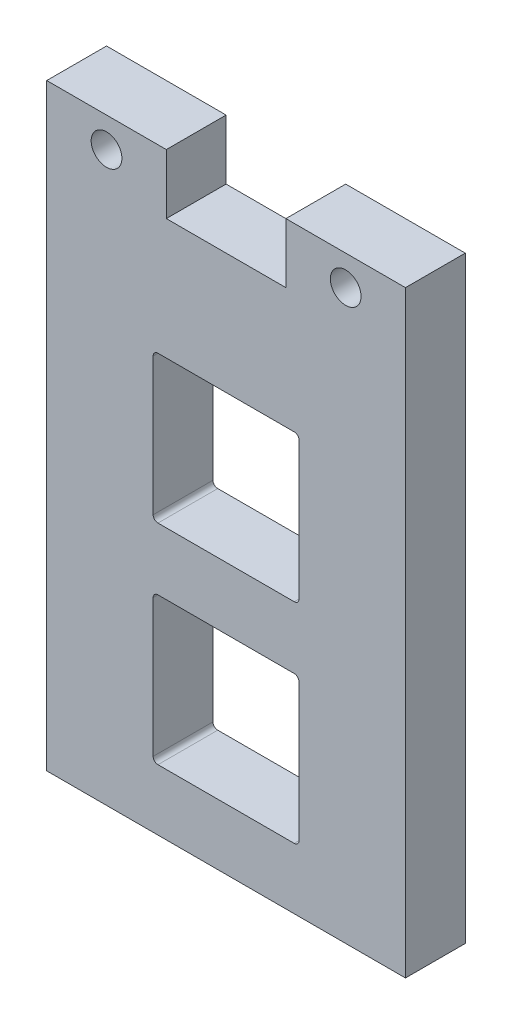
ISO-10303-21;
HEADER;
FILE_DESCRIPTION(('STEP AP214'),'2;1');
FILE_NAME('part.step','',(''),(''),'','','');
FILE_SCHEMA(('AUTOMOTIVE_DESIGN { 1 0 10303 214 1 1 1 1 }'));
ENDSEC;
DATA;
#1=APPLICATION_CONTEXT('core data for automotive mechanical design processes');
#2=APPLICATION_PROTOCOL_DEFINITION('international standard','automotive_design',2000,#1);
#3=PRODUCT_CONTEXT('',#1,'mechanical');
#4=PRODUCT('Part','Part','',(#3));
#5=PRODUCT_RELATED_PRODUCT_CATEGORY('part','',(#4));
#6=PRODUCT_DEFINITION_FORMATION('','',#4);
#7=PRODUCT_DEFINITION_CONTEXT('part definition',#1,'design');
#8=PRODUCT_DEFINITION('design','',#6,#7);
#9=PRODUCT_DEFINITION_SHAPE('','',#8);
#10=(LENGTH_UNIT() NAMED_UNIT(*) SI_UNIT(.MILLI.,.METRE.));
#11=(NAMED_UNIT(*) PLANE_ANGLE_UNIT() SI_UNIT($,.RADIAN.));
#12=(NAMED_UNIT(*) SI_UNIT($,.STERADIAN.) SOLID_ANGLE_UNIT());
#13=UNCERTAINTY_MEASURE_WITH_UNIT(LENGTH_MEASURE(1.E-05),#10,'distance_accuracy_value','');
#14=(GEOMETRIC_REPRESENTATION_CONTEXT(3) GLOBAL_UNCERTAINTY_ASSIGNED_CONTEXT((#13)) GLOBAL_UNIT_ASSIGNED_CONTEXT((#10,
#11,#12)) REPRESENTATION_CONTEXT('',''));
#15=CARTESIAN_POINT('',(0.,0.,0.));
#16=DIRECTION('',(0.,0.,1.));
#17=DIRECTION('',(1.,0.,0.));
#18=AXIS2_PLACEMENT_3D('',#15,#16,#17);
#19=CARTESIAN_POINT('',(0.,0.,3.175));
#20=DIRECTION('',(0.,-1.,0.));
#21=DIRECTION('',(0.,0.,-1.));
#22=AXIS2_PLACEMENT_3D('',#19,#20,#21);
#23=PLANE('',#22);
#24=DIRECTION('',(-1.,0.,0.));
#25=VECTOR('',#24,1.);
#26=CARTESIAN_POINT('',(0.,0.,-3.175));
#27=LINE('',#26,#25);
#28=CARTESIAN_POINT('',(38.1,0.,-3.175));
#29=VERTEX_POINT('',#28);
#30=CARTESIAN_POINT('',(25.4,0.,-3.175));
#31=VERTEX_POINT('',#30);
#32=EDGE_CURVE('E259',#29,#31,#27,.T.);
#33=ORIENTED_EDGE('',*,*,#32,.T.);
#34=DIRECTION('',(0.,0.,1.));
#35=VECTOR('',#34,1.);
#36=CARTESIAN_POINT('',(25.4,0.,-3.176));
#37=LINE('',#36,#35);
#38=CARTESIAN_POINT('',(25.4,0.,3.175));
#39=VERTEX_POINT('',#38);
#40=EDGE_CURVE('E241',#31,#39,#37,.T.);
#41=ORIENTED_EDGE('',*,*,#40,.T.);
#42=DIRECTION('',(-1.,0.,0.));
#43=VECTOR('',#42,1.);
#44=CARTESIAN_POINT('',(0.,0.,3.175));
#45=LINE('',#44,#43);
#46=CARTESIAN_POINT('',(38.1,0.,3.175));
#47=VERTEX_POINT('',#46);
#48=EDGE_CURVE('E283',#47,#39,#45,.T.);
#49=ORIENTED_EDGE('',*,*,#48,.F.);
#50=DIRECTION('',(0.,0.,-1.));
#51=VECTOR('',#50,1.);
#52=CARTESIAN_POINT('',(38.1,0.,3.175));
#53=LINE('',#52,#51);
#54=EDGE_CURVE('E266',#47,#29,#53,.T.);
#55=ORIENTED_EDGE('',*,*,#54,.T.);
#56=EDGE_LOOP('',(#33,#41,#49,#55));
#57=FACE_BOUND('',#56,.T.);
#58=ADVANCED_FACE('F40',(#57),#23,.F.);
#59=CARTESIAN_POINT('',(0.,0.,3.175));
#60=DIRECTION('',(1.,0.,0.));
#61=DIRECTION('',(0.,1.,0.));
#62=AXIS2_PLACEMENT_3D('',#59,#60,#61);
#63=PLANE('',#62);
#64=DIRECTION('',(0.,-1.,0.));
#65=VECTOR('',#64,1.);
#66=CARTESIAN_POINT('',(0.,0.,-3.175));
#67=LINE('',#66,#65);
#68=CARTESIAN_POINT('',(0.,0.,-3.175));
#69=VERTEX_POINT('',#68);
#70=CARTESIAN_POINT('',(0.,-63.5,-3.175));
#71=VERTEX_POINT('',#70);
#72=EDGE_CURVE('E477',#69,#71,#67,.T.);
#73=ORIENTED_EDGE('',*,*,#72,.T.);
#74=DIRECTION('',(0.,0.,-1.));
#75=VECTOR('',#74,1.);
#76=CARTESIAN_POINT('',(0.,-63.5,3.175));
#77=LINE('',#76,#75);
#78=CARTESIAN_POINT('',(0.,-63.5,3.175));
#79=VERTEX_POINT('',#78);
#80=EDGE_CURVE('E289',#79,#71,#77,.T.);
#81=ORIENTED_EDGE('',*,*,#80,.F.);
#82=DIRECTION('',(0.,-1.,0.));
#83=VECTOR('',#82,1.);
#84=CARTESIAN_POINT('',(0.,0.,3.175));
#85=LINE('',#84,#83);
#86=CARTESIAN_POINT('',(0.,0.,3.175));
#87=VERTEX_POINT('',#86);
#88=EDGE_CURVE('E267',#87,#79,#85,.T.);
#89=ORIENTED_EDGE('',*,*,#88,.F.);
#90=DIRECTION('',(0.,0.,-1.));
#91=VECTOR('',#90,1.);
#92=CARTESIAN_POINT('',(0.,0.,3.175));
#93=LINE('',#92,#91);
#94=EDGE_CURVE('E279',#87,#69,#93,.T.);
#95=ORIENTED_EDGE('',*,*,#94,.T.);
#96=EDGE_LOOP('',(#73,#81,#89,#95));
#97=FACE_BOUND('',#96,.T.);
#98=ADVANCED_FACE('F500',(#97),#63,.F.);
#99=CARTESIAN_POINT('',(0.,-63.5,3.175));
#100=DIRECTION('',(0.,1.,0.));
#101=DIRECTION('',(0.,0.,1.));
#102=AXIS2_PLACEMENT_3D('',#99,#100,#101);
#103=PLANE('',#102);
#104=DIRECTION('',(1.,0.,0.));
#105=VECTOR('',#104,1.);
#106=CARTESIAN_POINT('',(0.,-63.5,-3.175));
#107=LINE('',#106,#105);
#108=CARTESIAN_POINT('',(38.1,-63.5,-3.175));
#109=VERTEX_POINT('',#108);
#110=EDGE_CURVE('E488',#71,#109,#107,.T.);
#111=ORIENTED_EDGE('',*,*,#110,.T.);
#112=DIRECTION('',(0.,0.,-1.));
#113=VECTOR('',#112,1.);
#114=CARTESIAN_POINT('',(38.1,-63.5,3.175));
#115=LINE('',#114,#113);
#116=CARTESIAN_POINT('',(38.1,-63.5,3.175));
#117=VERTEX_POINT('',#116);
#118=EDGE_CURVE('E285',#117,#109,#115,.T.);
#119=ORIENTED_EDGE('',*,*,#118,.F.);
#120=DIRECTION('',(1.,0.,0.));
#121=VECTOR('',#120,1.);
#122=CARTESIAN_POINT('',(0.,-63.5,3.175));
#123=LINE('',#122,#121);
#124=EDGE_CURVE('E272',#79,#117,#123,.T.);
#125=ORIENTED_EDGE('',*,*,#124,.F.);
#126=ORIENTED_EDGE('',*,*,#80,.T.);
#127=EDGE_LOOP('',(#111,#119,#125,#126));
#128=FACE_BOUND('',#127,.T.);
#129=ADVANCED_FACE('F497',(#128),#103,.F.);
#130=CARTESIAN_POINT('',(38.1,-63.5,3.175));
#131=DIRECTION('',(-1.,0.,0.));
#132=DIRECTION('',(0.,0.,1.));
#133=AXIS2_PLACEMENT_3D('',#130,#131,#132);
#134=PLANE('',#133);
#135=DIRECTION('',(0.,1.,0.));
#136=VECTOR('',#135,1.);
#137=CARTESIAN_POINT('',(38.1,-63.5,-3.175));
#138=LINE('',#137,#136);
#139=EDGE_CURVE('E275',#109,#29,#138,.T.);
#140=ORIENTED_EDGE('',*,*,#139,.T.);
#141=ORIENTED_EDGE('',*,*,#54,.F.);
#142=DIRECTION('',(0.,1.,0.));
#143=VECTOR('',#142,1.);
#144=CARTESIAN_POINT('',(38.1,-63.5,3.175));
#145=LINE('',#144,#143);
#146=EDGE_CURVE('E481',#117,#47,#145,.T.);
#147=ORIENTED_EDGE('',*,*,#146,.F.);
#148=ORIENTED_EDGE('',*,*,#118,.T.);
#149=EDGE_LOOP('',(#140,#141,#147,#148));
#150=FACE_BOUND('',#149,.T.);
#151=ADVANCED_FACE('F492',(#150),#134,.F.);
#152=CARTESIAN_POINT('',(12.7,0.,3.175));
#153=VERTEX_POINT('',#152);
#154=EDGE_CURVE('E484',#153,#87,#45,.T.);
#155=ORIENTED_EDGE('',*,*,#154,.F.);
#156=DIRECTION('',(0.,0.,1.));
#157=VECTOR('',#156,1.);
#158=CARTESIAN_POINT('',(12.7,0.,-3.176));
#159=LINE('',#158,#157);
#160=CARTESIAN_POINT('',(12.7,0.,-3.175));
#161=VERTEX_POINT('',#160);
#162=EDGE_CURVE('E252',#161,#153,#159,.T.);
#163=ORIENTED_EDGE('',*,*,#162,.F.);
#164=EDGE_CURVE('E268',#161,#69,#27,.T.);
#165=ORIENTED_EDGE('',*,*,#164,.T.);
#166=ORIENTED_EDGE('',*,*,#94,.F.);
#167=EDGE_LOOP('',(#155,#163,#165,#166));
#168=FACE_BOUND('',#167,.T.);
#169=ADVANCED_FACE('F504',(#168),#23,.F.);
#170=CARTESIAN_POINT('',(0.,0.,3.175));
#171=DIRECTION('',(0.,0.,1.));
#172=DIRECTION('',(1.,0.,0.));
#173=AXIS2_PLACEMENT_3D('',#170,#171,#172);
#174=PLANE('',#173);
#175=DIRECTION('',(-1.,0.,0.));
#176=VECTOR('',#175,1.);
#177=CARTESIAN_POINT('',(26.797,-57.023,3.175));
#178=LINE('',#177,#176);
#179=CARTESIAN_POINT('',(26.289,-57.023,3.175));
#180=VERTEX_POINT('',#179);
#181=CARTESIAN_POINT('',(11.811,-57.023,3.175));
#182=VERTEX_POINT('',#181);
#183=EDGE_CURVE('E518',#180,#182,#178,.T.);
#184=ORIENTED_EDGE('',*,*,#183,.T.);
#185=CARTESIAN_POINT('',(11.811,-56.515,3.175));
#186=DIRECTION('',(0.,0.,1.));
#187=DIRECTION('',(1.,0.,0.));
#188=AXIS2_PLACEMENT_3D('',#185,#186,#187);
#189=CIRCLE('',#188,0.508);
#190=CARTESIAN_POINT('',(11.303,-56.515,3.175));
#191=VERTEX_POINT('',#190);
#192=EDGE_CURVE('E362',#182,#191,#189,.F.);
#193=ORIENTED_EDGE('',*,*,#192,.T.);
#194=DIRECTION('',(0.,1.,0.));
#195=VECTOR('',#194,1.);
#196=CARTESIAN_POINT('',(11.303,-57.023,3.175));
#197=LINE('',#196,#195);
#198=CARTESIAN_POINT('',(11.303,-41.91,3.175));
#199=VERTEX_POINT('',#198);
#200=EDGE_CURVE('E531',#191,#199,#197,.T.);
#201=ORIENTED_EDGE('',*,*,#200,.T.);
#202=CARTESIAN_POINT('',(11.811,-41.91,3.175));
#203=DIRECTION('',(0.,0.,1.));
#204=DIRECTION('',(1.,0.,0.));
#205=AXIS2_PLACEMENT_3D('',#202,#203,#204);
#206=CIRCLE('',#205,0.508);
#207=CARTESIAN_POINT('',(11.811,-41.402,3.175));
#208=VERTEX_POINT('',#207);
#209=EDGE_CURVE('E356',#199,#208,#206,.F.);
#210=ORIENTED_EDGE('',*,*,#209,.T.);
#211=DIRECTION('',(1.,0.,0.));
#212=VECTOR('',#211,1.);
#213=CARTESIAN_POINT('',(26.797,-41.402,3.175));
#214=LINE('',#213,#212);
#215=CARTESIAN_POINT('',(26.289,-41.402,3.175));
#216=VERTEX_POINT('',#215);
#217=EDGE_CURVE('E416',#208,#216,#214,.T.);
#218=ORIENTED_EDGE('',*,*,#217,.T.);
#219=CARTESIAN_POINT('',(26.289,-41.91,3.175));
#220=DIRECTION('',(0.,0.,1.));
#221=DIRECTION('',(1.,0.,0.));
#222=AXIS2_PLACEMENT_3D('',#219,#220,#221);
#223=CIRCLE('',#222,0.508);
#224=CARTESIAN_POINT('',(26.797,-41.91,3.175));
#225=VERTEX_POINT('',#224);
#226=EDGE_CURVE('E350',#216,#225,#223,.F.);
#227=ORIENTED_EDGE('',*,*,#226,.T.);
#228=DIRECTION('',(0.,-1.,0.));
#229=VECTOR('',#228,1.);
#230=CARTESIAN_POINT('',(26.797,-57.023,3.175));
#231=LINE('',#230,#229);
#232=CARTESIAN_POINT('',(26.797,-56.515,3.175));
#233=VERTEX_POINT('',#232);
#234=EDGE_CURVE('E516',#225,#233,#231,.T.);
#235=ORIENTED_EDGE('',*,*,#234,.T.);
#236=CARTESIAN_POINT('',(26.289,-56.515,3.175));
#237=DIRECTION('',(0.,0.,1.));
#238=DIRECTION('',(1.,0.,0.));
#239=AXIS2_PLACEMENT_3D('',#236,#237,#238);
#240=CIRCLE('',#239,0.508);
#241=EDGE_CURVE('E368',#233,#180,#240,.F.);
#242=ORIENTED_EDGE('',*,*,#241,.T.);
#243=EDGE_LOOP('',(#184,#193,#201,#210,#218,#227,#235,#242));
#244=FACE_BOUND('',#243,.T.);
#245=DIRECTION('',(-1.,0.,0.));
#246=VECTOR('',#245,1.);
#247=CARTESIAN_POINT('',(26.797,-34.798,3.175));
#248=LINE('',#247,#246);
#249=CARTESIAN_POINT('',(26.289,-34.798,3.175));
#250=VERTEX_POINT('',#249);
#251=CARTESIAN_POINT('',(11.811,-34.798,3.175));
#252=VERTEX_POINT('',#251);
#253=EDGE_CURVE('E415',#250,#252,#248,.T.);
#254=ORIENTED_EDGE('',*,*,#253,.T.);
#255=CARTESIAN_POINT('',(11.811,-34.29,3.175));
#256=DIRECTION('',(0.,0.,1.));
#257=DIRECTION('',(1.,0.,0.));
#258=AXIS2_PLACEMENT_3D('',#255,#256,#257);
#259=CIRCLE('',#258,0.508);
#260=CARTESIAN_POINT('',(11.303,-34.29,3.175));
#261=VERTEX_POINT('',#260);
#262=EDGE_CURVE('E380',#252,#261,#259,.F.);
#263=ORIENTED_EDGE('',*,*,#262,.T.);
#264=DIRECTION('',(0.,1.,0.));
#265=VECTOR('',#264,1.);
#266=CARTESIAN_POINT('',(11.303,-34.798,3.175));
#267=LINE('',#266,#265);
#268=CARTESIAN_POINT('',(11.303,-19.685,3.175));
#269=VERTEX_POINT('',#268);
#270=EDGE_CURVE('E421',#261,#269,#267,.T.);
#271=ORIENTED_EDGE('',*,*,#270,.T.);
#272=CARTESIAN_POINT('',(11.811,-19.685,3.175));
#273=DIRECTION('',(0.,0.,1.));
#274=DIRECTION('',(1.,0.,0.));
#275=AXIS2_PLACEMENT_3D('',#272,#273,#274);
#276=CIRCLE('',#275,0.508);
#277=CARTESIAN_POINT('',(11.811,-19.177,3.175));
#278=VERTEX_POINT('',#277);
#279=EDGE_CURVE('E69',#269,#278,#276,.F.);
#280=ORIENTED_EDGE('',*,*,#279,.T.);
#281=DIRECTION('',(1.,0.,0.));
#282=VECTOR('',#281,1.);
#283=CARTESIAN_POINT('',(26.797,-19.177,3.175));
#284=LINE('',#283,#282);
#285=CARTESIAN_POINT('',(26.289,-19.177,3.175));
#286=VERTEX_POINT('',#285);
#287=EDGE_CURVE('E410',#278,#286,#284,.T.);
#288=ORIENTED_EDGE('',*,*,#287,.T.);
#289=CARTESIAN_POINT('',(26.289,-19.685,3.175));
#290=DIRECTION('',(0.,0.,1.));
#291=DIRECTION('',(1.,0.,0.));
#292=AXIS2_PLACEMENT_3D('',#289,#290,#291);
#293=CIRCLE('',#292,0.508);
#294=CARTESIAN_POINT('',(26.797,-19.685,3.175));
#295=VERTEX_POINT('',#294);
#296=EDGE_CURVE('E11',#286,#295,#293,.F.);
#297=ORIENTED_EDGE('',*,*,#296,.T.);
#298=DIRECTION('',(0.,-1.,0.));
#299=VECTOR('',#298,1.);
#300=CARTESIAN_POINT('',(26.797,-34.798,3.175));
#301=LINE('',#300,#299);
#302=CARTESIAN_POINT('',(26.797,-34.29,3.175));
#303=VERTEX_POINT('',#302);
#304=EDGE_CURVE('E408',#295,#303,#301,.T.);
#305=ORIENTED_EDGE('',*,*,#304,.T.);
#306=CARTESIAN_POINT('',(26.289,-34.29,3.175));
#307=DIRECTION('',(0.,0.,1.));
#308=DIRECTION('',(1.,0.,0.));
#309=AXIS2_PLACEMENT_3D('',#306,#307,#308);
#310=CIRCLE('',#309,0.508);
#311=EDGE_CURVE('E374',#303,#250,#310,.F.);
#312=ORIENTED_EDGE('',*,*,#311,.T.);
#313=EDGE_LOOP('',(#254,#263,#271,#280,#288,#297,#305,#312));
#314=FACE_BOUND('',#313,.T.);
#315=DIRECTION('',(0.,1.,0.));
#316=VECTOR('',#315,1.);
#317=CARTESIAN_POINT('',(25.4,-6.35,3.175));
#318=LINE('',#317,#316);
#319=CARTESIAN_POINT('',(25.4,-6.35,3.175));
#320=VERTEX_POINT('',#319);
#321=EDGE_CURVE('E247',#320,#39,#318,.T.);
#322=ORIENTED_EDGE('',*,*,#321,.F.);
#323=DIRECTION('',(1.,0.,0.));
#324=VECTOR('',#323,1.);
#325=CARTESIAN_POINT('',(25.4,-6.35,3.175));
#326=LINE('',#325,#324);
#327=CARTESIAN_POINT('',(12.7,-6.35,3.175));
#328=VERTEX_POINT('',#327);
#329=EDGE_CURVE('E253',#328,#320,#326,.T.);
#330=ORIENTED_EDGE('',*,*,#329,.F.);
#331=DIRECTION('',(0.,-1.,0.));
#332=VECTOR('',#331,1.);
#333=CARTESIAN_POINT('',(12.7,-6.35,3.175));
#334=LINE('',#333,#332);
#335=EDGE_CURVE('E447',#153,#328,#334,.T.);
#336=ORIENTED_EDGE('',*,*,#335,.F.);
#337=ORIENTED_EDGE('',*,*,#154,.T.);
#338=ORIENTED_EDGE('',*,*,#88,.T.);
#339=ORIENTED_EDGE('',*,*,#124,.T.);
#340=ORIENTED_EDGE('',*,*,#146,.T.);
#341=ORIENTED_EDGE('',*,*,#48,.T.);
#342=EDGE_LOOP('',(#322,#330,#336,#337,#338,#339,#340,#341));
#343=FACE_BOUND('',#342,.T.);
#344=CARTESIAN_POINT('',(6.35,-3.175,3.175));
#345=DIRECTION('',(0.,0.,1.));
#346=DIRECTION('',(1.,0.,0.));
#347=AXIS2_PLACEMENT_3D('',#344,#345,#346);
#348=CIRCLE('',#347,1.63194999999999);
#349=CARTESIAN_POINT('',(7.98194999999999,-3.175,3.175));
#350=VERTEX_POINT('',#349);
#351=EDGE_CURVE('E457',#350,#350,#348,.T.);
#352=ORIENTED_EDGE('',*,*,#351,.F.);
#353=EDGE_LOOP('',(#352));
#354=FACE_BOUND('',#353,.T.);
#355=CARTESIAN_POINT('',(31.75,-3.175,3.175));
#356=DIRECTION('',(0.,0.,1.));
#357=DIRECTION('',(1.,0.,0.));
#358=AXIS2_PLACEMENT_3D('',#355,#356,#357);
#359=CIRCLE('',#358,1.63194999999999);
#360=CARTESIAN_POINT('',(33.38195,-3.175,3.175));
#361=VERTEX_POINT('',#360);
#362=EDGE_CURVE('E470',#361,#361,#359,.T.);
#363=ORIENTED_EDGE('',*,*,#362,.F.);
#364=EDGE_LOOP('',(#363));
#365=FACE_BOUND('',#364,.T.);
#366=ADVANCED_FACE('F406',(#244,#314,#343,#354,#365),#174,.T.);
#367=CARTESIAN_POINT('',(0.,0.,-3.175));
#368=DIRECTION('',(0.,0.,1.));
#369=DIRECTION('',(1.,0.,0.));
#370=AXIS2_PLACEMENT_3D('',#367,#368,#369);
#371=PLANE('',#370);
#372=DIRECTION('',(1.,0.,0.));
#373=VECTOR('',#372,1.);
#374=CARTESIAN_POINT('',(26.797,-41.402,-3.175));
#375=LINE('',#374,#373);
#376=CARTESIAN_POINT('',(11.811,-41.402,-3.175));
#377=VERTEX_POINT('',#376);
#378=CARTESIAN_POINT('',(26.289,-41.402,-3.175));
#379=VERTEX_POINT('',#378);
#380=EDGE_CURVE('E523',#377,#379,#375,.T.);
#381=ORIENTED_EDGE('',*,*,#380,.F.);
#382=CARTESIAN_POINT('',(11.811,-41.91,-3.175));
#383=DIRECTION('',(0.,0.,1.));
#384=DIRECTION('',(1.,0.,0.));
#385=AXIS2_PLACEMENT_3D('',#382,#383,#384);
#386=CIRCLE('',#385,0.508);
#387=CARTESIAN_POINT('',(11.303,-41.91,-3.175));
#388=VERTEX_POINT('',#387);
#389=EDGE_CURVE('E353',#377,#388,#386,.T.);
#390=ORIENTED_EDGE('',*,*,#389,.T.);
#391=DIRECTION('',(0.,1.,0.));
#392=VECTOR('',#391,1.);
#393=CARTESIAN_POINT('',(11.303,-57.023,-3.175));
#394=LINE('',#393,#392);
#395=CARTESIAN_POINT('',(11.303,-56.515,-3.175));
#396=VERTEX_POINT('',#395);
#397=EDGE_CURVE('E527',#396,#388,#394,.T.);
#398=ORIENTED_EDGE('',*,*,#397,.F.);
#399=CARTESIAN_POINT('',(11.811,-56.515,-3.175));
#400=DIRECTION('',(0.,0.,1.));
#401=DIRECTION('',(1.,0.,0.));
#402=AXIS2_PLACEMENT_3D('',#399,#400,#401);
#403=CIRCLE('',#402,0.508);
#404=CARTESIAN_POINT('',(11.811,-57.023,-3.175));
#405=VERTEX_POINT('',#404);
#406=EDGE_CURVE('E359',#396,#405,#403,.T.);
#407=ORIENTED_EDGE('',*,*,#406,.T.);
#408=DIRECTION('',(-1.,0.,0.));
#409=VECTOR('',#408,1.);
#410=CARTESIAN_POINT('',(26.797,-57.023,-3.175));
#411=LINE('',#410,#409);
#412=CARTESIAN_POINT('',(26.289,-57.023,-3.175));
#413=VERTEX_POINT('',#412);
#414=EDGE_CURVE('E425',#413,#405,#411,.T.);
#415=ORIENTED_EDGE('',*,*,#414,.F.);
#416=CARTESIAN_POINT('',(26.289,-56.515,-3.175));
#417=DIRECTION('',(0.,0.,1.));
#418=DIRECTION('',(1.,0.,0.));
#419=AXIS2_PLACEMENT_3D('',#416,#417,#418);
#420=CIRCLE('',#419,0.508);
#421=CARTESIAN_POINT('',(26.797,-56.515,-3.175));
#422=VERTEX_POINT('',#421);
#423=EDGE_CURVE('E365',#413,#422,#420,.T.);
#424=ORIENTED_EDGE('',*,*,#423,.T.);
#425=DIRECTION('',(0.,-1.,0.));
#426=VECTOR('',#425,1.);
#427=CARTESIAN_POINT('',(26.797,-57.023,-3.175));
#428=LINE('',#427,#426);
#429=CARTESIAN_POINT('',(26.797,-41.91,-3.175));
#430=VERTEX_POINT('',#429);
#431=EDGE_CURVE('E521',#430,#422,#428,.T.);
#432=ORIENTED_EDGE('',*,*,#431,.F.);
#433=CARTESIAN_POINT('',(26.289,-41.91,-3.175));
#434=DIRECTION('',(0.,0.,1.));
#435=DIRECTION('',(1.,0.,0.));
#436=AXIS2_PLACEMENT_3D('',#433,#434,#435);
#437=CIRCLE('',#436,0.508);
#438=EDGE_CURVE('E347',#430,#379,#437,.T.);
#439=ORIENTED_EDGE('',*,*,#438,.T.);
#440=EDGE_LOOP('',(#381,#390,#398,#407,#415,#424,#432,#439));
#441=FACE_BOUND('',#440,.T.);
#442=DIRECTION('',(1.,0.,0.));
#443=VECTOR('',#442,1.);
#444=CARTESIAN_POINT('',(26.797,-19.177,-3.175));
#445=LINE('',#444,#443);
#446=CARTESIAN_POINT('',(11.811,-19.177,-3.175));
#447=VERTEX_POINT('',#446);
#448=CARTESIAN_POINT('',(26.289,-19.177,-3.175));
#449=VERTEX_POINT('',#448);
#450=EDGE_CURVE('E393',#447,#449,#445,.T.);
#451=ORIENTED_EDGE('',*,*,#450,.F.);
#452=CARTESIAN_POINT('',(11.811,-19.685,-3.175));
#453=DIRECTION('',(0.,0.,1.));
#454=DIRECTION('',(1.,0.,0.));
#455=AXIS2_PLACEMENT_3D('',#452,#453,#454);
#456=CIRCLE('',#455,0.508);
#457=CARTESIAN_POINT('',(11.303,-19.685,-3.175));
#458=VERTEX_POINT('',#457);
#459=EDGE_CURVE('E383',#447,#458,#456,.T.);
#460=ORIENTED_EDGE('',*,*,#459,.T.);
#461=DIRECTION('',(0.,1.,0.));
#462=VECTOR('',#461,1.);
#463=CARTESIAN_POINT('',(11.303,-34.798,-3.175));
#464=LINE('',#463,#462);
#465=CARTESIAN_POINT('',(11.303,-34.29,-3.175));
#466=VERTEX_POINT('',#465);
#467=EDGE_CURVE('E400',#466,#458,#464,.T.);
#468=ORIENTED_EDGE('',*,*,#467,.F.);
#469=CARTESIAN_POINT('',(11.811,-34.29,-3.175));
#470=DIRECTION('',(0.,0.,1.));
#471=DIRECTION('',(1.,0.,0.));
#472=AXIS2_PLACEMENT_3D('',#469,#470,#471);
#473=CIRCLE('',#472,0.508);
#474=CARTESIAN_POINT('',(11.811,-34.798,-3.175));
#475=VERTEX_POINT('',#474);
#476=EDGE_CURVE('E377',#466,#475,#473,.T.);
#477=ORIENTED_EDGE('',*,*,#476,.T.);
#478=DIRECTION('',(-1.,0.,0.));
#479=VECTOR('',#478,1.);
#480=CARTESIAN_POINT('',(26.797,-34.798,-3.175));
#481=LINE('',#480,#479);
#482=CARTESIAN_POINT('',(26.289,-34.798,-3.175));
#483=VERTEX_POINT('',#482);
#484=EDGE_CURVE('E436',#483,#475,#481,.T.);
#485=ORIENTED_EDGE('',*,*,#484,.F.);
#486=CARTESIAN_POINT('',(26.289,-34.29,-3.175));
#487=DIRECTION('',(0.,0.,1.));
#488=DIRECTION('',(1.,0.,0.));
#489=AXIS2_PLACEMENT_3D('',#486,#487,#488);
#490=CIRCLE('',#489,0.508);
#491=CARTESIAN_POINT('',(26.797,-34.29,-3.175));
#492=VERTEX_POINT('',#491);
#493=EDGE_CURVE('E371',#483,#492,#490,.T.);
#494=ORIENTED_EDGE('',*,*,#493,.T.);
#495=DIRECTION('',(0.,-1.,0.));
#496=VECTOR('',#495,1.);
#497=CARTESIAN_POINT('',(26.797,-34.798,-3.175));
#498=LINE('',#497,#496);
#499=CARTESIAN_POINT('',(26.797,-19.685,-3.175));
#500=VERTEX_POINT('',#499);
#501=EDGE_CURVE('E395',#500,#492,#498,.T.);
#502=ORIENTED_EDGE('',*,*,#501,.F.);
#503=CARTESIAN_POINT('',(26.289,-19.685,-3.175));
#504=DIRECTION('',(0.,0.,1.));
#505=DIRECTION('',(1.,0.,0.));
#506=AXIS2_PLACEMENT_3D('',#503,#504,#505);
#507=CIRCLE('',#506,0.508);
#508=EDGE_CURVE('E49',#500,#449,#507,.T.);
#509=ORIENTED_EDGE('',*,*,#508,.T.);
#510=EDGE_LOOP('',(#451,#460,#468,#477,#485,#494,#502,#509));
#511=FACE_BOUND('',#510,.T.);
#512=CARTESIAN_POINT('',(6.35,-3.175,-3.175));
#513=DIRECTION('',(0.,0.,1.));
#514=DIRECTION('',(1.,0.,0.));
#515=AXIS2_PLACEMENT_3D('',#512,#513,#514);
#516=CIRCLE('',#515,1.63194999999999);
#517=CARTESIAN_POINT('',(7.98194999999999,-3.175,-3.175));
#518=VERTEX_POINT('',#517);
#519=EDGE_CURVE('E466',#518,#518,#516,.T.);
#520=ORIENTED_EDGE('',*,*,#519,.T.);
#521=EDGE_LOOP('',(#520));
#522=FACE_BOUND('',#521,.T.);
#523=CARTESIAN_POINT('',(31.75,-3.175,-3.175));
#524=DIRECTION('',(0.,0.,1.));
#525=DIRECTION('',(1.,0.,0.));
#526=AXIS2_PLACEMENT_3D('',#523,#524,#525);
#527=CIRCLE('',#526,1.63194999999999);
#528=CARTESIAN_POINT('',(33.38195,-3.175,-3.175));
#529=VERTEX_POINT('',#528);
#530=EDGE_CURVE('E474',#529,#529,#527,.T.);
#531=ORIENTED_EDGE('',*,*,#530,.T.);
#532=EDGE_LOOP('',(#531));
#533=FACE_BOUND('',#532,.T.);
#534=DIRECTION('',(-1.,0.,0.));
#535=VECTOR('',#534,1.);
#536=CARTESIAN_POINT('',(25.4,-6.35,-3.175));
#537=LINE('',#536,#535);
#538=CARTESIAN_POINT('',(25.4,-6.35,-3.175));
#539=VERTEX_POINT('',#538);
#540=CARTESIAN_POINT('',(12.7,-6.35,-3.175));
#541=VERTEX_POINT('',#540);
#542=EDGE_CURVE('E261',#539,#541,#537,.T.);
#543=ORIENTED_EDGE('',*,*,#542,.F.);
#544=DIRECTION('',(0.,-1.,0.));
#545=VECTOR('',#544,1.);
#546=CARTESIAN_POINT('',(25.4,-6.35,-3.175));
#547=LINE('',#546,#545);
#548=EDGE_CURVE('E244',#31,#539,#547,.T.);
#549=ORIENTED_EDGE('',*,*,#548,.F.);
#550=ORIENTED_EDGE('',*,*,#32,.F.);
#551=ORIENTED_EDGE('',*,*,#139,.F.);
#552=ORIENTED_EDGE('',*,*,#110,.F.);
#553=ORIENTED_EDGE('',*,*,#72,.F.);
#554=ORIENTED_EDGE('',*,*,#164,.F.);
#555=DIRECTION('',(0.,1.,0.));
#556=VECTOR('',#555,1.);
#557=CARTESIAN_POINT('',(12.7,-6.35,-3.175));
#558=LINE('',#557,#556);
#559=EDGE_CURVE('E441',#541,#161,#558,.T.);
#560=ORIENTED_EDGE('',*,*,#559,.F.);
#561=EDGE_LOOP('',(#543,#549,#550,#551,#552,#553,#554,#560));
#562=FACE_BOUND('',#561,.T.);
#563=ADVANCED_FACE('F257',(#441,#511,#522,#533,#562),#371,.F.);
#564=CARTESIAN_POINT('',(31.75,-3.175,3.175));
#565=DIRECTION('',(0.,0.,1.));
#566=DIRECTION('',(1.,0.,0.));
#567=AXIS2_PLACEMENT_3D('',#564,#565,#566);
#568=CYLINDRICAL_SURFACE('',#567,1.63194999999999);
#569=ORIENTED_EDGE('',*,*,#530,.F.);
#570=EDGE_LOOP('',(#569));
#571=FACE_BOUND('',#570,.T.);
#572=ORIENTED_EDGE('',*,*,#362,.T.);
#573=EDGE_LOOP('',(#572));
#574=FACE_BOUND('',#573,.T.);
#575=ADVANCED_FACE('F661',(#571,#574),#568,.F.);
#576=CARTESIAN_POINT('',(6.35,-3.175,3.175));
#577=DIRECTION('',(0.,0.,1.));
#578=DIRECTION('',(1.,0.,0.));
#579=AXIS2_PLACEMENT_3D('',#576,#577,#578);
#580=CYLINDRICAL_SURFACE('',#579,1.63194999999999);
#581=ORIENTED_EDGE('',*,*,#519,.F.);
#582=EDGE_LOOP('',(#581));
#583=FACE_BOUND('',#582,.T.);
#584=ORIENTED_EDGE('',*,*,#351,.T.);
#585=EDGE_LOOP('',(#584));
#586=FACE_BOUND('',#585,.T.);
#587=ADVANCED_FACE('F658',(#583,#586),#580,.F.);
#588=CARTESIAN_POINT('',(25.4,-6.35,-3.176));
#589=DIRECTION('',(1.,0.,0.));
#590=DIRECTION('',(0.,0.,-1.));
#591=AXIS2_PLACEMENT_3D('',#588,#589,#590);
#592=PLANE('',#591);
#593=ORIENTED_EDGE('',*,*,#548,.T.);
#594=DIRECTION('',(0.,0.,1.));
#595=VECTOR('',#594,1.);
#596=CARTESIAN_POINT('',(25.4,-6.35,-3.176));
#597=LINE('',#596,#595);
#598=EDGE_CURVE('E454',#539,#320,#597,.T.);
#599=ORIENTED_EDGE('',*,*,#598,.T.);
#600=ORIENTED_EDGE('',*,*,#321,.T.);
#601=ORIENTED_EDGE('',*,*,#40,.F.);
#602=EDGE_LOOP('',(#593,#599,#600,#601));
#603=FACE_BOUND('',#602,.T.);
#604=ADVANCED_FACE('F243',(#603),#592,.F.);
#605=CARTESIAN_POINT('',(25.4,-6.35,-3.176));
#606=DIRECTION('',(0.,-1.,0.));
#607=DIRECTION('',(1.,0.,0.));
#608=AXIS2_PLACEMENT_3D('',#605,#606,#607);
#609=PLANE('',#608);
#610=ORIENTED_EDGE('',*,*,#542,.T.);
#611=DIRECTION('',(0.,0.,1.));
#612=VECTOR('',#611,1.);
#613=CARTESIAN_POINT('',(12.7,-6.35,-3.176));
#614=LINE('',#613,#612);
#615=EDGE_CURVE('E458',#541,#328,#614,.T.);
#616=ORIENTED_EDGE('',*,*,#615,.T.);
#617=ORIENTED_EDGE('',*,*,#329,.T.);
#618=ORIENTED_EDGE('',*,*,#598,.F.);
#619=EDGE_LOOP('',(#610,#616,#617,#618));
#620=FACE_BOUND('',#619,.T.);
#621=ADVANCED_FACE('F512',(#620),#609,.F.);
#622=CARTESIAN_POINT('',(12.7,-6.35,-3.176));
#623=DIRECTION('',(-1.,0.,0.));
#624=DIRECTION('',(0.,0.,1.));
#625=AXIS2_PLACEMENT_3D('',#622,#623,#624);
#626=PLANE('',#625);
#627=ORIENTED_EDGE('',*,*,#559,.T.);
#628=ORIENTED_EDGE('',*,*,#162,.T.);
#629=ORIENTED_EDGE('',*,*,#335,.T.);
#630=ORIENTED_EDGE('',*,*,#615,.F.);
#631=EDGE_LOOP('',(#627,#628,#629,#630));
#632=FACE_BOUND('',#631,.T.);
#633=ADVANCED_FACE('F508',(#632),#626,.F.);
#634=CARTESIAN_POINT('',(11.303,-34.798,3.176));
#635=DIRECTION('',(-1.,0.,0.));
#636=DIRECTION('',(0.,0.,1.));
#637=AXIS2_PLACEMENT_3D('',#634,#635,#636);
#638=PLANE('',#637);
#639=ORIENTED_EDGE('',*,*,#270,.F.);
#640=DIRECTION('',(0.,0.,-1.));
#641=VECTOR('',#640,1.);
#642=CARTESIAN_POINT('',(11.303,-34.29,-3.175));
#643=LINE('',#642,#641);
#644=EDGE_CURVE('E337',#261,#466,#643,.T.);
#645=ORIENTED_EDGE('',*,*,#644,.T.);
#646=ORIENTED_EDGE('',*,*,#467,.T.);
#647=DIRECTION('',(0.,0.,-1.));
#648=VECTOR('',#647,1.);
#649=CARTESIAN_POINT('',(11.303,-19.685,3.175));
#650=LINE('',#649,#648);
#651=EDGE_CURVE('E334',#458,#269,#650,.F.);
#652=ORIENTED_EDGE('',*,*,#651,.T.);
#653=EDGE_LOOP('',(#639,#645,#646,#652));
#654=FACE_BOUND('',#653,.T.);
#655=ADVANCED_FACE('F631',(#654),#638,.F.);
#656=CARTESIAN_POINT('',(26.797,-34.798,3.176));
#657=DIRECTION('',(0.,-1.,0.));
#658=DIRECTION('',(0.,0.,-1.));
#659=AXIS2_PLACEMENT_3D('',#656,#657,#658);
#660=PLANE('',#659);
#661=ORIENTED_EDGE('',*,*,#253,.F.);
#662=DIRECTION('',(0.,0.,-1.));
#663=VECTOR('',#662,1.);
#664=CARTESIAN_POINT('',(26.289,-34.798,-3.175));
#665=LINE('',#664,#663);
#666=EDGE_CURVE('E323',#250,#483,#665,.T.);
#667=ORIENTED_EDGE('',*,*,#666,.T.);
#668=ORIENTED_EDGE('',*,*,#484,.T.);
#669=DIRECTION('',(0.,0.,-1.));
#670=VECTOR('',#669,1.);
#671=CARTESIAN_POINT('',(11.811,-34.798,3.175));
#672=LINE('',#671,#670);
#673=EDGE_CURVE('E320',#475,#252,#672,.F.);
#674=ORIENTED_EDGE('',*,*,#673,.T.);
#675=EDGE_LOOP('',(#661,#667,#668,#674));
#676=FACE_BOUND('',#675,.T.);
#677=ADVANCED_FACE('F638',(#676),#660,.F.);
#678=CARTESIAN_POINT('',(26.797,-34.798,3.176));
#679=DIRECTION('',(1.,0.,0.));
#680=DIRECTION('',(0.,0.,-1.));
#681=AXIS2_PLACEMENT_3D('',#678,#679,#680);
#682=PLANE('',#681);
#683=ORIENTED_EDGE('',*,*,#501,.T.);
#684=DIRECTION('',(0.,0.,-1.));
#685=VECTOR('',#684,1.);
#686=CARTESIAN_POINT('',(26.797,-34.29,3.175));
#687=LINE('',#686,#685);
#688=EDGE_CURVE('E331',#492,#303,#687,.F.);
#689=ORIENTED_EDGE('',*,*,#688,.T.);
#690=ORIENTED_EDGE('',*,*,#304,.F.);
#691=DIRECTION('',(0.,0.,-1.));
#692=VECTOR('',#691,1.);
#693=CARTESIAN_POINT('',(26.797,-19.685,-3.175));
#694=LINE('',#693,#692);
#695=EDGE_CURVE('E327',#295,#500,#694,.T.);
#696=ORIENTED_EDGE('',*,*,#695,.T.);
#697=EDGE_LOOP('',(#683,#689,#690,#696));
#698=FACE_BOUND('',#697,.T.);
#699=ADVANCED_FACE('F412',(#698),#682,.F.);
#700=CARTESIAN_POINT('',(26.797,-19.177,3.176));
#701=DIRECTION('',(0.,1.,0.));
#702=DIRECTION('',(0.,0.,1.));
#703=AXIS2_PLACEMENT_3D('',#700,#701,#702);
#704=PLANE('',#703);
#705=ORIENTED_EDGE('',*,*,#287,.F.);
#706=DIRECTION('',(0.,0.,-1.));
#707=VECTOR('',#706,1.);
#708=CARTESIAN_POINT('',(11.811,-19.177,-3.175));
#709=LINE('',#708,#707);
#710=EDGE_CURVE('E343',#278,#447,#709,.T.);
#711=ORIENTED_EDGE('',*,*,#710,.T.);
#712=ORIENTED_EDGE('',*,*,#450,.T.);
#713=DIRECTION('',(0.,0.,-1.));
#714=VECTOR('',#713,1.);
#715=CARTESIAN_POINT('',(26.289,-19.177,3.175));
#716=LINE('',#715,#714);
#717=EDGE_CURVE('E59',#449,#286,#716,.F.);
#718=ORIENTED_EDGE('',*,*,#717,.T.);
#719=EDGE_LOOP('',(#705,#711,#712,#718));
#720=FACE_BOUND('',#719,.T.);
#721=ADVANCED_FACE('F398',(#720),#704,.F.);
#722=CARTESIAN_POINT('',(11.303,-57.023,3.176));
#723=DIRECTION('',(-1.,0.,0.));
#724=DIRECTION('',(0.,0.,1.));
#725=AXIS2_PLACEMENT_3D('',#722,#723,#724);
#726=PLANE('',#725);
#727=ORIENTED_EDGE('',*,*,#397,.T.);
#728=DIRECTION('',(0.,0.,-1.));
#729=VECTOR('',#728,1.);
#730=CARTESIAN_POINT('',(11.303,-41.91,3.175));
#731=LINE('',#730,#729);
#732=EDGE_CURVE('E310',#388,#199,#731,.F.);
#733=ORIENTED_EDGE('',*,*,#732,.T.);
#734=ORIENTED_EDGE('',*,*,#200,.F.);
#735=DIRECTION('',(0.,0.,-1.));
#736=VECTOR('',#735,1.);
#737=CARTESIAN_POINT('',(11.303,-56.515,-3.175));
#738=LINE('',#737,#736);
#739=EDGE_CURVE('E306',#191,#396,#738,.T.);
#740=ORIENTED_EDGE('',*,*,#739,.T.);
#741=EDGE_LOOP('',(#727,#733,#734,#740));
#742=FACE_BOUND('',#741,.T.);
#743=ADVANCED_FACE('F554',(#742),#726,.F.);
#744=CARTESIAN_POINT('',(26.797,-57.023,3.176));
#745=DIRECTION('',(0.,-1.,0.));
#746=DIRECTION('',(0.,0.,-1.));
#747=AXIS2_PLACEMENT_3D('',#744,#745,#746);
#748=PLANE('',#747);
#749=ORIENTED_EDGE('',*,*,#414,.T.);
#750=DIRECTION('',(0.,0.,-1.));
#751=VECTOR('',#750,1.);
#752=CARTESIAN_POINT('',(11.811,-57.023,3.175));
#753=LINE('',#752,#751);
#754=EDGE_CURVE('E317',#405,#182,#753,.F.);
#755=ORIENTED_EDGE('',*,*,#754,.T.);
#756=ORIENTED_EDGE('',*,*,#183,.F.);
#757=DIRECTION('',(0.,0.,-1.));
#758=VECTOR('',#757,1.);
#759=CARTESIAN_POINT('',(26.289,-57.023,-3.175));
#760=LINE('',#759,#758);
#761=EDGE_CURVE('E313',#180,#413,#760,.T.);
#762=ORIENTED_EDGE('',*,*,#761,.T.);
#763=EDGE_LOOP('',(#749,#755,#756,#762));
#764=FACE_BOUND('',#763,.T.);
#765=ADVANCED_FACE('F578',(#764),#748,.F.);
#766=CARTESIAN_POINT('',(26.797,-57.023,3.176));
#767=DIRECTION('',(1.,0.,0.));
#768=DIRECTION('',(0.,0.,-1.));
#769=AXIS2_PLACEMENT_3D('',#766,#767,#768);
#770=PLANE('',#769);
#771=ORIENTED_EDGE('',*,*,#234,.F.);
#772=DIRECTION('',(0.,0.,-1.));
#773=VECTOR('',#772,1.);
#774=CARTESIAN_POINT('',(26.797,-41.91,-3.175));
#775=LINE('',#774,#773);
#776=EDGE_CURVE('E295',#225,#430,#775,.T.);
#777=ORIENTED_EDGE('',*,*,#776,.T.);
#778=ORIENTED_EDGE('',*,*,#431,.T.);
#779=DIRECTION('',(0.,0.,-1.));
#780=VECTOR('',#779,1.);
#781=CARTESIAN_POINT('',(26.797,-56.515,3.175));
#782=LINE('',#781,#780);
#783=EDGE_CURVE('E292',#422,#233,#782,.F.);
#784=ORIENTED_EDGE('',*,*,#783,.T.);
#785=EDGE_LOOP('',(#771,#777,#778,#784));
#786=FACE_BOUND('',#785,.T.);
#787=ADVANCED_FACE('F574',(#786),#770,.F.);
#788=CARTESIAN_POINT('',(26.797,-41.402,3.176));
#789=DIRECTION('',(0.,1.,0.));
#790=DIRECTION('',(0.,0.,1.));
#791=AXIS2_PLACEMENT_3D('',#788,#789,#790);
#792=PLANE('',#791);
#793=ORIENTED_EDGE('',*,*,#380,.T.);
#794=DIRECTION('',(0.,0.,-1.));
#795=VECTOR('',#794,1.);
#796=CARTESIAN_POINT('',(26.289,-41.402,3.175));
#797=LINE('',#796,#795);
#798=EDGE_CURVE('E303',#379,#216,#797,.F.);
#799=ORIENTED_EDGE('',*,*,#798,.T.);
#800=ORIENTED_EDGE('',*,*,#217,.F.);
#801=DIRECTION('',(0.,0.,-1.));
#802=VECTOR('',#801,1.);
#803=CARTESIAN_POINT('',(11.811,-41.402,-3.175));
#804=LINE('',#803,#802);
#805=EDGE_CURVE('E299',#208,#377,#804,.T.);
#806=ORIENTED_EDGE('',*,*,#805,.T.);
#807=EDGE_LOOP('',(#793,#799,#800,#806));
#808=FACE_BOUND('',#807,.T.);
#809=ADVANCED_FACE('F565',(#808),#792,.F.);
#810=CARTESIAN_POINT('',(26.289,-41.91,3.176));
#811=DIRECTION('',(0.,0.,1.));
#812=DIRECTION('',(1.,0.,0.));
#813=AXIS2_PLACEMENT_3D('',#810,#811,#812);
#814=CYLINDRICAL_SURFACE('',#813,0.508);
#815=ORIENTED_EDGE('',*,*,#226,.F.);
#816=ORIENTED_EDGE('',*,*,#798,.F.);
#817=ORIENTED_EDGE('',*,*,#438,.F.);
#818=ORIENTED_EDGE('',*,*,#776,.F.);
#819=EDGE_LOOP('',(#815,#816,#817,#818));
#820=FACE_BOUND('',#819,.T.);
#821=ADVANCED_FACE('F571',(#820),#814,.F.);
#822=CARTESIAN_POINT('',(11.811,-41.91,3.176));
#823=DIRECTION('',(0.,0.,1.));
#824=DIRECTION('',(1.,0.,0.));
#825=AXIS2_PLACEMENT_3D('',#822,#823,#824);
#826=CYLINDRICAL_SURFACE('',#825,0.508);
#827=ORIENTED_EDGE('',*,*,#209,.F.);
#828=ORIENTED_EDGE('',*,*,#732,.F.);
#829=ORIENTED_EDGE('',*,*,#389,.F.);
#830=ORIENTED_EDGE('',*,*,#805,.F.);
#831=EDGE_LOOP('',(#827,#828,#829,#830));
#832=FACE_BOUND('',#831,.T.);
#833=ADVANCED_FACE('F562',(#832),#826,.F.);
#834=CARTESIAN_POINT('',(11.811,-56.515,3.176));
#835=DIRECTION('',(0.,0.,1.));
#836=DIRECTION('',(1.,0.,0.));
#837=AXIS2_PLACEMENT_3D('',#834,#835,#836);
#838=CYLINDRICAL_SURFACE('',#837,0.508);
#839=ORIENTED_EDGE('',*,*,#192,.F.);
#840=ORIENTED_EDGE('',*,*,#754,.F.);
#841=ORIENTED_EDGE('',*,*,#406,.F.);
#842=ORIENTED_EDGE('',*,*,#739,.F.);
#843=EDGE_LOOP('',(#839,#840,#841,#842));
#844=FACE_BOUND('',#843,.T.);
#845=ADVANCED_FACE('F551',(#844),#838,.F.);
#846=CARTESIAN_POINT('',(26.289,-56.515,3.176));
#847=DIRECTION('',(0.,0.,1.));
#848=DIRECTION('',(1.,0.,0.));
#849=AXIS2_PLACEMENT_3D('',#846,#847,#848);
#850=CYLINDRICAL_SURFACE('',#849,0.508);
#851=ORIENTED_EDGE('',*,*,#241,.F.);
#852=ORIENTED_EDGE('',*,*,#783,.F.);
#853=ORIENTED_EDGE('',*,*,#423,.F.);
#854=ORIENTED_EDGE('',*,*,#761,.F.);
#855=EDGE_LOOP('',(#851,#852,#853,#854));
#856=FACE_BOUND('',#855,.T.);
#857=ADVANCED_FACE('F577',(#856),#850,.F.);
#858=CARTESIAN_POINT('',(26.289,-34.29,3.176));
#859=DIRECTION('',(0.,0.,1.));
#860=DIRECTION('',(1.,0.,0.));
#861=AXIS2_PLACEMENT_3D('',#858,#859,#860);
#862=CYLINDRICAL_SURFACE('',#861,0.508);
#863=ORIENTED_EDGE('',*,*,#311,.F.);
#864=ORIENTED_EDGE('',*,*,#688,.F.);
#865=ORIENTED_EDGE('',*,*,#493,.F.);
#866=ORIENTED_EDGE('',*,*,#666,.F.);
#867=EDGE_LOOP('',(#863,#864,#865,#866));
#868=FACE_BOUND('',#867,.T.);
#869=ADVANCED_FACE('F614',(#868),#862,.F.);
#870=CARTESIAN_POINT('',(11.811,-34.29,3.176));
#871=DIRECTION('',(0.,0.,1.));
#872=DIRECTION('',(1.,0.,0.));
#873=AXIS2_PLACEMENT_3D('',#870,#871,#872);
#874=CYLINDRICAL_SURFACE('',#873,0.508);
#875=ORIENTED_EDGE('',*,*,#262,.F.);
#876=ORIENTED_EDGE('',*,*,#673,.F.);
#877=ORIENTED_EDGE('',*,*,#476,.F.);
#878=ORIENTED_EDGE('',*,*,#644,.F.);
#879=EDGE_LOOP('',(#875,#876,#877,#878));
#880=FACE_BOUND('',#879,.T.);
#881=ADVANCED_FACE('F617',(#880),#874,.F.);
#882=CARTESIAN_POINT('',(11.811,-19.685,3.176));
#883=DIRECTION('',(0.,0.,1.));
#884=DIRECTION('',(1.,0.,0.));
#885=AXIS2_PLACEMENT_3D('',#882,#883,#884);
#886=CYLINDRICAL_SURFACE('',#885,0.508);
#887=ORIENTED_EDGE('',*,*,#279,.F.);
#888=ORIENTED_EDGE('',*,*,#651,.F.);
#889=ORIENTED_EDGE('',*,*,#459,.F.);
#890=ORIENTED_EDGE('',*,*,#710,.F.);
#891=EDGE_LOOP('',(#887,#888,#889,#890));
#892=FACE_BOUND('',#891,.T.);
#893=ADVANCED_FACE('F620',(#892),#886,.F.);
#894=CARTESIAN_POINT('',(26.289,-19.685,3.176));
#895=DIRECTION('',(0.,0.,1.));
#896=DIRECTION('',(1.,0.,0.));
#897=AXIS2_PLACEMENT_3D('',#894,#895,#896);
#898=CYLINDRICAL_SURFACE('',#897,0.508);
#899=ORIENTED_EDGE('',*,*,#296,.F.);
#900=ORIENTED_EDGE('',*,*,#717,.F.);
#901=ORIENTED_EDGE('',*,*,#508,.F.);
#902=ORIENTED_EDGE('',*,*,#695,.F.);
#903=EDGE_LOOP('',(#899,#900,#901,#902));
#904=FACE_BOUND('',#903,.T.);
#905=ADVANCED_FACE('F42',(#904),#898,.F.);
#906=CLOSED_SHELL('',(#58,#98,#129,#151,#169,#366,#563,#575,#587,#604,#621,#633,#655,#677,#699,
#721,#743,#765,#787,#809,#821,#833,#845,#857,#869,#881,#893,#905));
#907=MANIFOLD_SOLID_BREP('B2',#906);
#908=ADVANCED_BREP_SHAPE_REPRESENTATION('',(#18,#907),#14);
#909=SHAPE_DEFINITION_REPRESENTATION(#9,#908);
ENDSEC;
END-ISO-10303-21;
